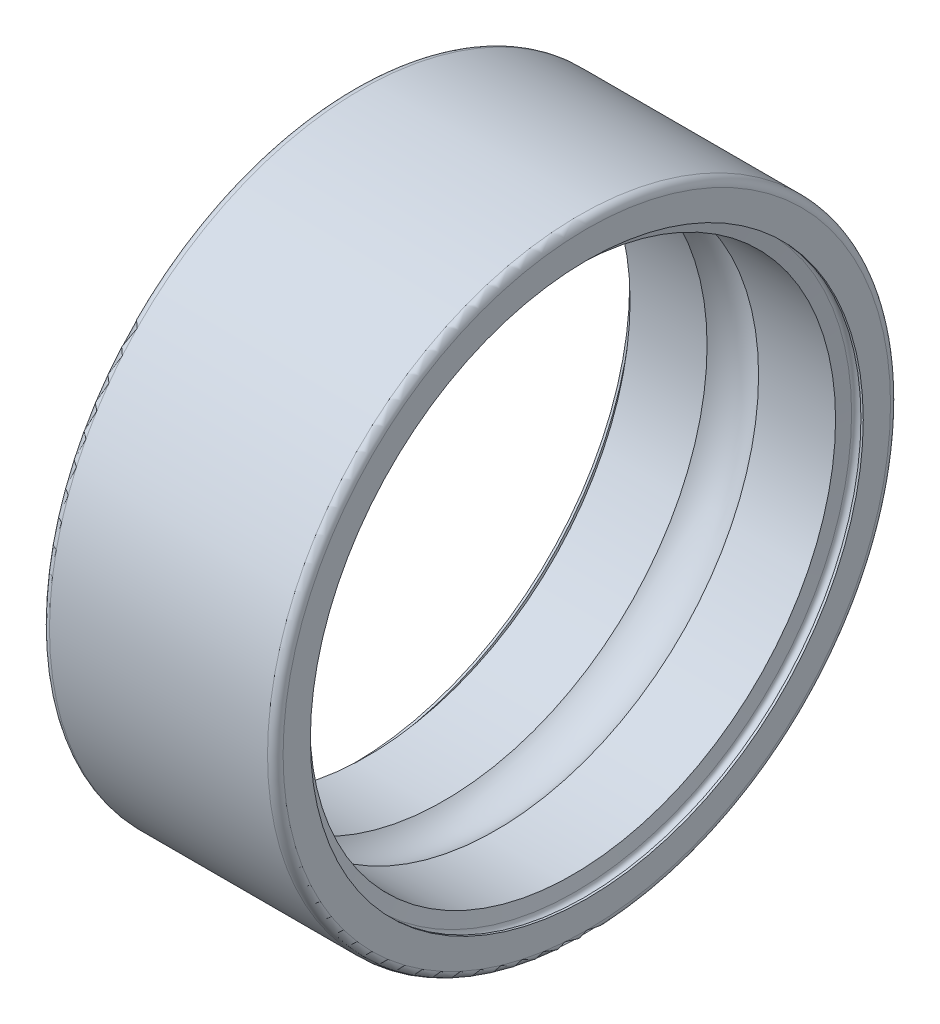
ISO-10303-21;
HEADER;
FILE_DESCRIPTION(('STEP AP214'),'2;1');
FILE_NAME('part.step','',(''),(''),'','','');
FILE_SCHEMA(('AUTOMOTIVE_DESIGN { 1 0 10303 214 1 1 1 1 }'));
ENDSEC;
DATA;
#1=APPLICATION_CONTEXT('core data for automotive mechanical design processes');
#2=APPLICATION_PROTOCOL_DEFINITION('international standard','automotive_design',2000,#1);
#3=PRODUCT_CONTEXT('',#1,'mechanical');
#4=PRODUCT('Part','Part','',(#3));
#5=PRODUCT_RELATED_PRODUCT_CATEGORY('part','',(#4));
#6=PRODUCT_DEFINITION_FORMATION('','',#4);
#7=PRODUCT_DEFINITION_CONTEXT('part definition',#1,'design');
#8=PRODUCT_DEFINITION('design','',#6,#7);
#9=PRODUCT_DEFINITION_SHAPE('','',#8);
#10=(LENGTH_UNIT() NAMED_UNIT(*) SI_UNIT(.MILLI.,.METRE.));
#11=(NAMED_UNIT(*) PLANE_ANGLE_UNIT() SI_UNIT($,.RADIAN.));
#12=(NAMED_UNIT(*) SI_UNIT($,.STERADIAN.) SOLID_ANGLE_UNIT());
#13=UNCERTAINTY_MEASURE_WITH_UNIT(LENGTH_MEASURE(1.E-05),#10,'distance_accuracy_value','');
#14=(GEOMETRIC_REPRESENTATION_CONTEXT(3) GLOBAL_UNCERTAINTY_ASSIGNED_CONTEXT((#13)) GLOBAL_UNIT_ASSIGNED_CONTEXT((#10,
#11,#12)) REPRESENTATION_CONTEXT('',''));
#15=CARTESIAN_POINT('',(0.,0.,0.));
#16=DIRECTION('',(0.,0.,1.));
#17=DIRECTION('',(1.,0.,0.));
#18=AXIS2_PLACEMENT_3D('',#15,#16,#17);
#19=CARTESIAN_POINT('',(0.,-8.0131268697387,-7.8));
#20=DIRECTION('',(-1.,0.,0.));
#21=DIRECTION('',(0.,0.,1.));
#22=AXIS2_PLACEMENT_3D('',#19,#20,#21);
#23=PLANE('',#22);
#24=CARTESIAN_POINT('',(0.,0.,0.));
#25=DIRECTION('',(-1.,0.,0.));
#26=DIRECTION('',(0.,0.,-1.));
#27=AXIS2_PLACEMENT_3D('',#24,#25,#26);
#28=CIRCLE('',#27,7.8);
#29=CARTESIAN_POINT('',(0.,0.,-7.8));
#30=VERTEX_POINT('',#29);
#31=EDGE_CURVE('E61',#30,#30,#28,.F.);
#32=ORIENTED_EDGE('',*,*,#31,.F.);
#33=EDGE_LOOP('',(#32));
#34=FACE_BOUND('',#33,.T.);
#35=CARTESIAN_POINT('',(0.,0.,0.));
#36=DIRECTION('',(1.,0.,0.));
#37=DIRECTION('',(0.,0.,1.));
#38=AXIS2_PLACEMENT_3D('',#35,#36,#37);
#39=CIRCLE('',#38,7.1);
#40=CARTESIAN_POINT('',(0.,0.,7.1));
#41=VERTEX_POINT('',#40);
#42=EDGE_CURVE('E58',#41,#41,#39,.T.);
#43=ORIENTED_EDGE('',*,*,#42,.T.);
#44=EDGE_LOOP('',(#43));
#45=FACE_BOUND('',#44,.T.);
#46=ADVANCED_FACE('F14',(#34,#45),#23,.T.);
#47=CARTESIAN_POINT('',(6.,-8.0131268697387,7.8));
#48=DIRECTION('',(1.,0.,0.));
#49=DIRECTION('',(0.,0.,-1.));
#50=AXIS2_PLACEMENT_3D('',#47,#48,#49);
#51=PLANE('',#50);
#52=CARTESIAN_POINT('',(6.,0.,0.));
#53=DIRECTION('',(1.,0.,0.));
#54=DIRECTION('',(0.,0.,1.));
#55=AXIS2_PLACEMENT_3D('',#52,#53,#54);
#56=CIRCLE('',#55,7.8000001091758);
#57=CARTESIAN_POINT('',(6.,0.,7.8000001091758));
#58=VERTEX_POINT('',#57);
#59=EDGE_CURVE('E55',#58,#58,#56,.T.);
#60=ORIENTED_EDGE('',*,*,#59,.T.);
#61=EDGE_LOOP('',(#60));
#62=FACE_BOUND('',#61,.T.);
#63=CARTESIAN_POINT('',(6.,0.,0.));
#64=DIRECTION('',(-1.,0.,0.));
#65=DIRECTION('',(0.,0.,-1.));
#66=AXIS2_PLACEMENT_3D('',#63,#64,#65);
#67=CIRCLE('',#66,7.1);
#68=CARTESIAN_POINT('',(6.,0.,-7.1));
#69=VERTEX_POINT('',#68);
#70=EDGE_CURVE('E52',#69,#69,#67,.F.);
#71=ORIENTED_EDGE('',*,*,#70,.F.);
#72=EDGE_LOOP('',(#71));
#73=FACE_BOUND('',#72,.T.);
#74=ADVANCED_FACE('F70',(#62,#73),#51,.T.);
#75=CARTESIAN_POINT('',(0.200000000000016,0.,0.));
#76=DIRECTION('',(1.,0.,0.));
#77=DIRECTION('',(0.,0.,1.));
#78=AXIS2_PLACEMENT_3D('',#75,#76,#77);
#79=TOROIDAL_SURFACE('',#78,7.8,0.200000000000014);
#80=ORIENTED_EDGE('',*,*,#31,.T.);
#81=EDGE_LOOP('',(#80));
#82=FACE_BOUND('',#81,.T.);
#83=CARTESIAN_POINT('',(0.200000000000016,0.,0.));
#84=DIRECTION('',(-1.,0.,0.));
#85=DIRECTION('',(0.,0.,-1.));
#86=AXIS2_PLACEMENT_3D('',#83,#84,#85);
#87=CIRCLE('',#86,8.00000000000001);
#88=CARTESIAN_POINT('',(0.200000000000016,0.,-8.00000000000001));
#89=VERTEX_POINT('',#88);
#90=EDGE_CURVE('E49',#89,#89,#87,.F.);
#91=ORIENTED_EDGE('',*,*,#90,.F.);
#92=EDGE_LOOP('',(#91));
#93=FACE_BOUND('',#92,.T.);
#94=ADVANCED_FACE('F65',(#82,#93),#79,.T.);
#95=CARTESIAN_POINT('',(50.,0.,0.));
#96=DIRECTION('',(1.,0.,0.));
#97=DIRECTION('',(0.,0.,1.));
#98=AXIS2_PLACEMENT_3D('',#95,#96,#97);
#99=CYLINDRICAL_SURFACE('',#98,7.1);
#100=CARTESIAN_POINT('',(0.0599999999999952,0.,0.));
#101=DIRECTION('',(1.,0.,0.));
#102=DIRECTION('',(0.,0.,1.));
#103=AXIS2_PLACEMENT_3D('',#100,#101,#102);
#104=CIRCLE('',#103,7.1);
#105=CARTESIAN_POINT('',(0.0599999999999952,0.,7.1));
#106=VERTEX_POINT('',#105);
#107=EDGE_CURVE('E46',#106,#106,#104,.T.);
#108=ORIENTED_EDGE('',*,*,#107,.T.);
#109=EDGE_LOOP('',(#108));
#110=FACE_BOUND('',#109,.T.);
#111=ORIENTED_EDGE('',*,*,#42,.F.);
#112=EDGE_LOOP('',(#111));
#113=FACE_BOUND('',#112,.T.);
#114=ADVANCED_FACE('F74',(#110,#113),#99,.F.);
#115=CARTESIAN_POINT('',(0.18,0.,0.));
#116=DIRECTION('',(1.,0.,0.));
#117=DIRECTION('',(0.,0.,1.));
#118=AXIS2_PLACEMENT_3D('',#115,#116,#117);
#119=TOROIDAL_SURFACE('',#118,7.1,0.12);
#120=ORIENTED_EDGE('',*,*,#107,.F.);
#121=EDGE_LOOP('',(#120));
#122=FACE_BOUND('',#121,.T.);
#123=CARTESIAN_POINT('',(0.3,0.,0.));
#124=DIRECTION('',(1.,0.,0.));
#125=DIRECTION('',(0.,0.,1.));
#126=AXIS2_PLACEMENT_3D('',#123,#124,#125);
#127=CIRCLE('',#126,7.1);
#128=CARTESIAN_POINT('',(0.3,0.,7.1));
#129=VERTEX_POINT('',#128);
#130=EDGE_CURVE('E43',#129,#129,#127,.T.);
#131=ORIENTED_EDGE('',*,*,#130,.T.);
#132=EDGE_LOOP('',(#131));
#133=FACE_BOUND('',#132,.T.);
#134=ADVANCED_FACE('F76',(#122,#133),#119,.F.);
#135=CARTESIAN_POINT('',(0.3,0.,0.));
#136=DIRECTION('',(-1.,0.,0.));
#137=DIRECTION('',(0.,0.,-1.));
#138=AXIS2_PLACEMENT_3D('',#135,#136,#137);
#139=CONICAL_SURFACE('',#138,7.1,1.39626340159548);
#140=ORIENTED_EDGE('',*,*,#130,.F.);
#141=EDGE_LOOP('',(#140));
#142=FACE_BOUND('',#141,.T.);
#143=CARTESIAN_POINT('',(0.361714443247957,0.,0.));
#144=DIRECTION('',(1.,0.,0.));
#145=DIRECTION('',(0.,0.,1.));
#146=AXIS2_PLACEMENT_3D('',#143,#144,#145);
#147=CIRCLE('',#146,6.75);
#148=CARTESIAN_POINT('',(0.361714443247957,0.,6.75));
#149=VERTEX_POINT('',#148);
#150=EDGE_CURVE('E40',#149,#149,#147,.T.);
#151=ORIENTED_EDGE('',*,*,#150,.T.);
#152=EDGE_LOOP('',(#151));
#153=FACE_BOUND('',#152,.T.);
#154=ADVANCED_FACE('F84',(#142,#153),#139,.F.);
#155=CARTESIAN_POINT('',(50.,0.,0.));
#156=DIRECTION('',(1.,0.,0.));
#157=DIRECTION('',(0.,0.,1.));
#158=AXIS2_PLACEMENT_3D('',#155,#156,#157);
#159=CYLINDRICAL_SURFACE('',#158,6.75);
#160=CARTESIAN_POINT('',(2.33856217223391,0.,0.));
#161=DIRECTION('',(1.,0.,0.));
#162=DIRECTION('',(0.,0.,1.));
#163=AXIS2_PLACEMENT_3D('',#160,#161,#162);
#164=CIRCLE('',#163,6.75);
#165=CARTESIAN_POINT('',(2.33856217223391,0.,6.75));
#166=VERTEX_POINT('',#165);
#167=EDGE_CURVE('E37',#166,#166,#164,.T.);
#168=ORIENTED_EDGE('',*,*,#167,.T.);
#169=EDGE_LOOP('',(#168));
#170=FACE_BOUND('',#169,.T.);
#171=ORIENTED_EDGE('',*,*,#150,.F.);
#172=EDGE_LOOP('',(#171));
#173=FACE_BOUND('',#172,.T.);
#174=ADVANCED_FACE('F92',(#170,#173),#159,.F.);
#175=CARTESIAN_POINT('',(3.,0.,0.));
#176=DIRECTION('',(1.,0.,0.));
#177=DIRECTION('',(0.,0.,1.));
#178=AXIS2_PLACEMENT_3D('',#175,#176,#177);
#179=TOROIDAL_SURFACE('',#178,6.00000000000013,0.999999999999873);
#180=ORIENTED_EDGE('',*,*,#167,.F.);
#181=EDGE_LOOP('',(#180));
#182=FACE_BOUND('',#181,.T.);
#183=CARTESIAN_POINT('',(3.6614378277661,0.,0.));
#184=DIRECTION('',(1.,0.,0.));
#185=DIRECTION('',(0.,0.,1.));
#186=AXIS2_PLACEMENT_3D('',#183,#184,#185);
#187=CIRCLE('',#186,6.75);
#188=CARTESIAN_POINT('',(3.6614378277661,0.,6.75));
#189=VERTEX_POINT('',#188);
#190=EDGE_CURVE('E34',#189,#189,#187,.T.);
#191=ORIENTED_EDGE('',*,*,#190,.T.);
#192=EDGE_LOOP('',(#191));
#193=FACE_BOUND('',#192,.T.);
#194=ADVANCED_FACE('F96',(#182,#193),#179,.F.);
#195=CARTESIAN_POINT('',(50.,0.,0.));
#196=DIRECTION('',(1.,0.,0.));
#197=DIRECTION('',(0.,0.,1.));
#198=AXIS2_PLACEMENT_3D('',#195,#196,#197);
#199=CYLINDRICAL_SURFACE('',#198,6.75);
#200=CARTESIAN_POINT('',(5.638285556752,0.,0.));
#201=DIRECTION('',(1.,0.,0.));
#202=DIRECTION('',(0.,0.,1.));
#203=AXIS2_PLACEMENT_3D('',#200,#201,#202);
#204=CIRCLE('',#203,6.75);
#205=CARTESIAN_POINT('',(5.638285556752,0.,6.75));
#206=VERTEX_POINT('',#205);
#207=EDGE_CURVE('E29',#206,#206,#204,.T.);
#208=ORIENTED_EDGE('',*,*,#207,.T.);
#209=EDGE_LOOP('',(#208));
#210=FACE_BOUND('',#209,.T.);
#211=ORIENTED_EDGE('',*,*,#190,.F.);
#212=EDGE_LOOP('',(#211));
#213=FACE_BOUND('',#212,.T.);
#214=ADVANCED_FACE('F100',(#210,#213),#199,.F.);
#215=CARTESIAN_POINT('',(5.7,0.,0.));
#216=DIRECTION('',(1.,0.,0.));
#217=DIRECTION('',(0.,0.,1.));
#218=AXIS2_PLACEMENT_3D('',#215,#216,#217);
#219=CONICAL_SURFACE('',#218,7.1,1.39626340159536);
#220=CARTESIAN_POINT('',(5.7,0.,0.));
#221=DIRECTION('',(1.,0.,0.));
#222=DIRECTION('',(0.,0.,1.));
#223=AXIS2_PLACEMENT_3D('',#220,#221,#222);
#224=CIRCLE('',#223,7.1);
#225=CARTESIAN_POINT('',(5.7,0.,7.1));
#226=VERTEX_POINT('',#225);
#227=EDGE_CURVE('E25',#226,#226,#224,.T.);
#228=ORIENTED_EDGE('',*,*,#227,.T.);
#229=EDGE_LOOP('',(#228));
#230=FACE_BOUND('',#229,.T.);
#231=ORIENTED_EDGE('',*,*,#207,.F.);
#232=EDGE_LOOP('',(#231));
#233=FACE_BOUND('',#232,.T.);
#234=ADVANCED_FACE('F104',(#230,#233),#219,.F.);
#235=CARTESIAN_POINT('',(5.82,0.,0.));
#236=DIRECTION('',(1.,0.,0.));
#237=DIRECTION('',(0.,0.,1.));
#238=AXIS2_PLACEMENT_3D('',#235,#236,#237);
#239=TOROIDAL_SURFACE('',#238,7.1,0.12);
#240=ORIENTED_EDGE('',*,*,#227,.F.);
#241=EDGE_LOOP('',(#240));
#242=FACE_BOUND('',#241,.T.);
#243=CARTESIAN_POINT('',(5.94,0.,0.));
#244=DIRECTION('',(1.,0.,0.));
#245=DIRECTION('',(0.,0.,1.));
#246=AXIS2_PLACEMENT_3D('',#243,#244,#245);
#247=CIRCLE('',#246,7.1);
#248=CARTESIAN_POINT('',(5.94,0.,7.1));
#249=VERTEX_POINT('',#248);
#250=EDGE_CURVE('E21',#249,#249,#247,.T.);
#251=ORIENTED_EDGE('',*,*,#250,.T.);
#252=EDGE_LOOP('',(#251));
#253=FACE_BOUND('',#252,.T.);
#254=ADVANCED_FACE('F108',(#242,#253),#239,.F.);
#255=CARTESIAN_POINT('',(50.,0.,0.));
#256=DIRECTION('',(1.,0.,0.));
#257=DIRECTION('',(0.,0.,1.));
#258=AXIS2_PLACEMENT_3D('',#255,#256,#257);
#259=CYLINDRICAL_SURFACE('',#258,7.1);
#260=ORIENTED_EDGE('',*,*,#70,.T.);
#261=EDGE_LOOP('',(#260));
#262=FACE_BOUND('',#261,.T.);
#263=ORIENTED_EDGE('',*,*,#250,.F.);
#264=EDGE_LOOP('',(#263));
#265=FACE_BOUND('',#264,.T.);
#266=ADVANCED_FACE('F112',(#262,#265),#259,.F.);
#267=CARTESIAN_POINT('',(5.8,0.,0.));
#268=DIRECTION('',(1.,0.,0.));
#269=DIRECTION('',(0.,0.,1.));
#270=AXIS2_PLACEMENT_3D('',#267,#268,#269);
#271=TOROIDAL_SURFACE('',#270,7.8,0.20000000000003);
#272=CARTESIAN_POINT('',(5.8,0.,0.));
#273=DIRECTION('',(1.,0.,0.));
#274=DIRECTION('',(0.,0.,1.));
#275=AXIS2_PLACEMENT_3D('',#272,#273,#274);
#276=CIRCLE('',#275,8.00000000000003);
#277=CARTESIAN_POINT('',(5.8,0.,8.00000000000003));
#278=VERTEX_POINT('',#277);
#279=EDGE_CURVE('E10',#278,#278,#276,.T.);
#280=ORIENTED_EDGE('',*,*,#279,.T.);
#281=EDGE_LOOP('',(#280));
#282=FACE_BOUND('',#281,.T.);
#283=ORIENTED_EDGE('',*,*,#59,.F.);
#284=EDGE_LOOP('',(#283));
#285=FACE_BOUND('',#284,.T.);
#286=ADVANCED_FACE('F115',(#282,#285),#271,.T.);
#287=CARTESIAN_POINT('',(50.,0.,0.));
#288=DIRECTION('',(1.,0.,0.));
#289=DIRECTION('',(0.,0.,1.));
#290=AXIS2_PLACEMENT_3D('',#287,#288,#289);
#291=CYLINDRICAL_SURFACE('',#290,8.);
#292=ORIENTED_EDGE('',*,*,#90,.T.);
#293=EDGE_LOOP('',(#292));
#294=FACE_BOUND('',#293,.T.);
#295=ORIENTED_EDGE('',*,*,#279,.F.);
#296=EDGE_LOOP('',(#295));
#297=FACE_BOUND('',#296,.T.);
#298=ADVANCED_FACE('F16',(#294,#297),#291,.T.);
#299=CLOSED_SHELL('',(#46,#74,#94,#114,#134,#154,#174,#194,#214,#234,#254,#266,#286,#298));
#300=MANIFOLD_SOLID_BREP('B1',#299);
#301=ADVANCED_BREP_SHAPE_REPRESENTATION('',(#18,#300),#14);
#302=SHAPE_DEFINITION_REPRESENTATION(#9,#301);
ENDSEC;
END-ISO-10303-21;
